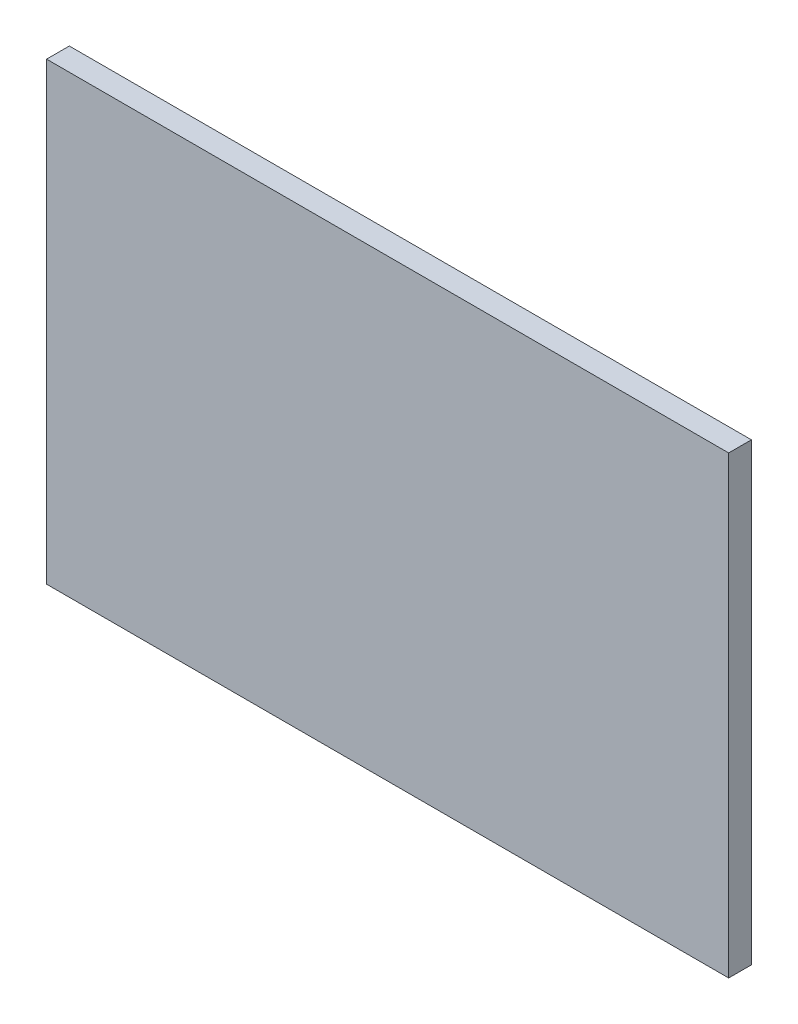
ISO-10303-21;
HEADER;
FILE_DESCRIPTION(('STEP AP214'),'2;1');
FILE_NAME('part.step','',(''),(''),'','','');
FILE_SCHEMA(('AUTOMOTIVE_DESIGN { 1 0 10303 214 1 1 1 1 }'));
ENDSEC;
DATA;
#1=APPLICATION_CONTEXT('core data for automotive mechanical design processes');
#2=APPLICATION_PROTOCOL_DEFINITION('international standard','automotive_design',2000,#1);
#3=PRODUCT_CONTEXT('',#1,'mechanical');
#4=PRODUCT('Part','Part','',(#3));
#5=PRODUCT_RELATED_PRODUCT_CATEGORY('part','',(#4));
#6=PRODUCT_DEFINITION_FORMATION('','',#4);
#7=PRODUCT_DEFINITION_CONTEXT('part definition',#1,'design');
#8=PRODUCT_DEFINITION('design','',#6,#7);
#9=PRODUCT_DEFINITION_SHAPE('','',#8);
#10=(LENGTH_UNIT() NAMED_UNIT(*) SI_UNIT(.MILLI.,.METRE.));
#11=(NAMED_UNIT(*) PLANE_ANGLE_UNIT() SI_UNIT($,.RADIAN.));
#12=(NAMED_UNIT(*) SI_UNIT($,.STERADIAN.) SOLID_ANGLE_UNIT());
#13=UNCERTAINTY_MEASURE_WITH_UNIT(LENGTH_MEASURE(1.E-05),#10,'distance_accuracy_value','');
#14=(GEOMETRIC_REPRESENTATION_CONTEXT(3) GLOBAL_UNCERTAINTY_ASSIGNED_CONTEXT((#13)) GLOBAL_UNIT_ASSIGNED_CONTEXT((#10,
#11,#12)) REPRESENTATION_CONTEXT('',''));
#15=CARTESIAN_POINT('',(0.,0.,0.));
#16=DIRECTION('',(0.,0.,1.));
#17=DIRECTION('',(1.,0.,0.));
#18=AXIS2_PLACEMENT_3D('',#15,#16,#17);
#19=CARTESIAN_POINT('',(0.,0.,25.));
#20=DIRECTION('',(1.,0.,0.));
#21=DIRECTION('',(0.,1.,0.));
#22=AXIS2_PLACEMENT_3D('',#19,#20,#21);
#23=PLANE('',#22);
#24=DIRECTION('',(0.,-1.,0.));
#25=VECTOR('',#24,1.);
#26=CARTESIAN_POINT('',(0.,0.,0.));
#27=LINE('',#26,#25);
#28=CARTESIAN_POINT('',(-1.11022302462516E-13,500.,0.));
#29=VERTEX_POINT('',#28);
#30=CARTESIAN_POINT('',(0.,0.,0.));
#31=VERTEX_POINT('',#30);
#32=EDGE_CURVE('E96',#29,#31,#27,.T.);
#33=ORIENTED_EDGE('',*,*,#32,.T.);
#34=DIRECTION('',(0.,0.,-1.));
#35=VECTOR('',#34,1.);
#36=CARTESIAN_POINT('',(0.,0.,25.));
#37=LINE('',#36,#35);
#38=CARTESIAN_POINT('',(0.,0.,25.));
#39=VERTEX_POINT('',#38);
#40=EDGE_CURVE('E11',#39,#31,#37,.T.);
#41=ORIENTED_EDGE('',*,*,#40,.F.);
#42=DIRECTION('',(0.,-1.,0.));
#43=VECTOR('',#42,1.);
#44=CARTESIAN_POINT('',(0.,0.,25.));
#45=LINE('',#44,#43);
#46=CARTESIAN_POINT('',(-1.11022302462516E-13,500.,25.));
#47=VERTEX_POINT('',#46);
#48=EDGE_CURVE('E84',#47,#39,#45,.T.);
#49=ORIENTED_EDGE('',*,*,#48,.F.);
#50=DIRECTION('',(0.,0.,-1.));
#51=VECTOR('',#50,1.);
#52=CARTESIAN_POINT('',(-1.11022302462516E-13,500.,25.));
#53=LINE('',#52,#51);
#54=EDGE_CURVE('E92',#47,#29,#53,.T.);
#55=ORIENTED_EDGE('',*,*,#54,.T.);
#56=EDGE_LOOP('',(#33,#41,#49,#55));
#57=FACE_BOUND('',#56,.T.);
#58=ADVANCED_FACE('F33',(#57),#23,.F.);
#59=CARTESIAN_POINT('',(0.,0.,25.));
#60=DIRECTION('',(0.,1.,0.));
#61=DIRECTION('',(0.,0.,1.));
#62=AXIS2_PLACEMENT_3D('',#59,#60,#61);
#63=PLANE('',#62);
#64=DIRECTION('',(1.,0.,0.));
#65=VECTOR('',#64,1.);
#66=CARTESIAN_POINT('',(0.,0.,0.));
#67=LINE('',#66,#65);
#68=CARTESIAN_POINT('',(750.,0.,0.));
#69=VERTEX_POINT('',#68);
#70=EDGE_CURVE('E88',#31,#69,#67,.T.);
#71=ORIENTED_EDGE('',*,*,#70,.T.);
#72=DIRECTION('',(0.,0.,-1.));
#73=VECTOR('',#72,1.);
#74=CARTESIAN_POINT('',(750.,0.,25.));
#75=LINE('',#74,#73);
#76=CARTESIAN_POINT('',(750.,0.,25.));
#77=VERTEX_POINT('',#76);
#78=EDGE_CURVE('E41',#77,#69,#75,.T.);
#79=ORIENTED_EDGE('',*,*,#78,.F.);
#80=DIRECTION('',(1.,0.,0.));
#81=VECTOR('',#80,1.);
#82=CARTESIAN_POINT('',(0.,0.,25.));
#83=LINE('',#82,#81);
#84=EDGE_CURVE('E79',#39,#77,#83,.T.);
#85=ORIENTED_EDGE('',*,*,#84,.F.);
#86=ORIENTED_EDGE('',*,*,#40,.T.);
#87=EDGE_LOOP('',(#71,#79,#85,#86));
#88=FACE_BOUND('',#87,.T.);
#89=ADVANCED_FACE('F87',(#88),#63,.F.);
#90=CARTESIAN_POINT('',(750.,0.,25.));
#91=DIRECTION('',(-1.,0.,0.));
#92=DIRECTION('',(0.,-1.,0.));
#93=AXIS2_PLACEMENT_3D('',#90,#91,#92);
#94=PLANE('',#93);
#95=DIRECTION('',(0.,1.,0.));
#96=VECTOR('',#95,1.);
#97=CARTESIAN_POINT('',(750.,0.,0.));
#98=LINE('',#97,#96);
#99=CARTESIAN_POINT('',(750.,500.,0.));
#100=VERTEX_POINT('',#99);
#101=EDGE_CURVE('E66',#69,#100,#98,.T.);
#102=ORIENTED_EDGE('',*,*,#101,.T.);
#103=DIRECTION('',(0.,0.,-1.));
#104=VECTOR('',#103,1.);
#105=CARTESIAN_POINT('',(750.,500.,25.));
#106=LINE('',#105,#104);
#107=CARTESIAN_POINT('',(750.,500.,25.));
#108=VERTEX_POINT('',#107);
#109=EDGE_CURVE('E89',#108,#100,#106,.T.);
#110=ORIENTED_EDGE('',*,*,#109,.F.);
#111=DIRECTION('',(0.,1.,0.));
#112=VECTOR('',#111,1.);
#113=CARTESIAN_POINT('',(750.,0.,25.));
#114=LINE('',#113,#112);
#115=EDGE_CURVE('E82',#77,#108,#114,.T.);
#116=ORIENTED_EDGE('',*,*,#115,.F.);
#117=ORIENTED_EDGE('',*,*,#78,.T.);
#118=EDGE_LOOP('',(#102,#110,#116,#117));
#119=FACE_BOUND('',#118,.T.);
#120=ADVANCED_FACE('F90',(#119),#94,.F.);
#121=CARTESIAN_POINT('',(-1.11022302462516E-13,500.,25.));
#122=DIRECTION('',(0.,-1.,0.));
#123=DIRECTION('',(0.,0.,-1.));
#124=AXIS2_PLACEMENT_3D('',#121,#122,#123);
#125=PLANE('',#124);
#126=DIRECTION('',(-1.,0.,0.));
#127=VECTOR('',#126,1.);
#128=CARTESIAN_POINT('',(-1.11022302462516E-13,500.,0.));
#129=LINE('',#128,#127);
#130=EDGE_CURVE('E72',#100,#29,#129,.T.);
#131=ORIENTED_EDGE('',*,*,#130,.T.);
#132=ORIENTED_EDGE('',*,*,#54,.F.);
#133=DIRECTION('',(-1.,0.,0.));
#134=VECTOR('',#133,1.);
#135=CARTESIAN_POINT('',(-1.11022302462516E-13,500.,25.));
#136=LINE('',#135,#134);
#137=EDGE_CURVE('E49',#108,#47,#136,.T.);
#138=ORIENTED_EDGE('',*,*,#137,.F.);
#139=ORIENTED_EDGE('',*,*,#109,.T.);
#140=EDGE_LOOP('',(#131,#132,#138,#139));
#141=FACE_BOUND('',#140,.T.);
#142=ADVANCED_FACE('F103',(#141),#125,.F.);
#143=CARTESIAN_POINT('',(0.,0.,25.));
#144=DIRECTION('',(0.,0.,-1.));
#145=DIRECTION('',(-1.,0.,0.));
#146=AXIS2_PLACEMENT_3D('',#143,#144,#145);
#147=PLANE('',#146);
#148=ORIENTED_EDGE('',*,*,#48,.T.);
#149=ORIENTED_EDGE('',*,*,#84,.T.);
#150=ORIENTED_EDGE('',*,*,#115,.T.);
#151=ORIENTED_EDGE('',*,*,#137,.T.);
#152=EDGE_LOOP('',(#148,#149,#150,#151));
#153=FACE_BOUND('',#152,.T.);
#154=ADVANCED_FACE('F80',(#153),#147,.F.);
#155=CARTESIAN_POINT('',(0.,0.,0.));
#156=DIRECTION('',(0.,0.,-1.));
#157=DIRECTION('',(-1.,0.,0.));
#158=AXIS2_PLACEMENT_3D('',#155,#156,#157);
#159=PLANE('',#158);
#160=ORIENTED_EDGE('',*,*,#32,.F.);
#161=ORIENTED_EDGE('',*,*,#130,.F.);
#162=ORIENTED_EDGE('',*,*,#101,.F.);
#163=ORIENTED_EDGE('',*,*,#70,.F.);
#164=EDGE_LOOP('',(#160,#161,#162,#163));
#165=FACE_BOUND('',#164,.T.);
#166=ADVANCED_FACE('F106',(#165),#159,.T.);
#167=CLOSED_SHELL('',(#58,#89,#120,#142,#154,#166));
#168=MANIFOLD_SOLID_BREP('B2',#167);
#169=ADVANCED_BREP_SHAPE_REPRESENTATION('',(#18,#168),#14);
#170=SHAPE_DEFINITION_REPRESENTATION(#9,#169);
ENDSEC;
END-ISO-10303-21;
